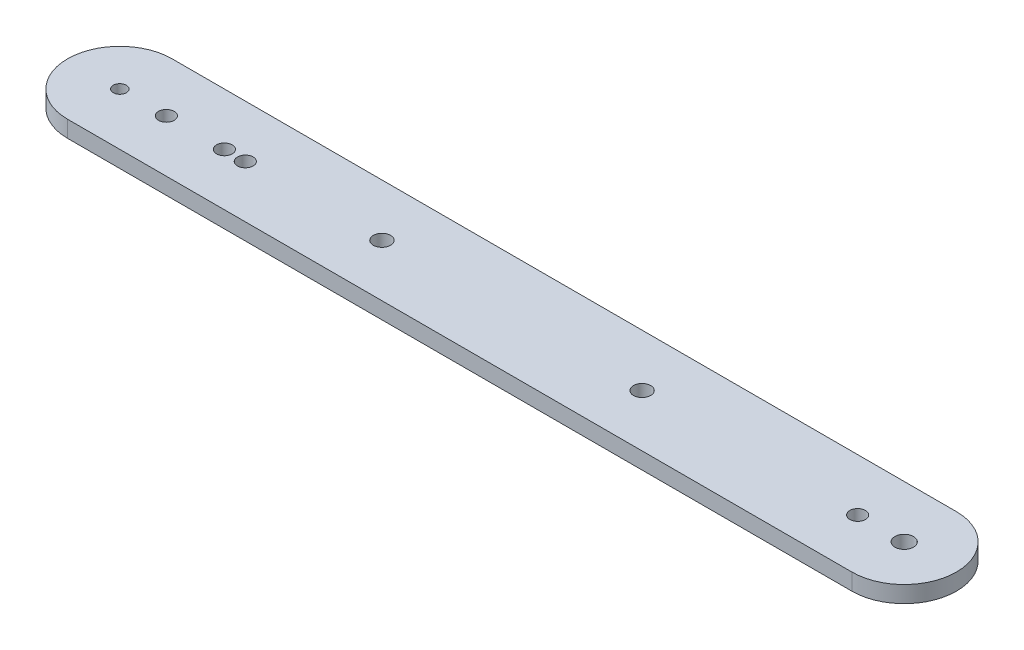
ISO-10303-21;
HEADER;
FILE_DESCRIPTION(('STEP AP214'),'2;1');
FILE_NAME('part.step','',(''),(''),'','','');
FILE_SCHEMA(('AUTOMOTIVE_DESIGN { 1 0 10303 214 1 1 1 1 }'));
ENDSEC;
DATA;
#1=APPLICATION_CONTEXT('core data for automotive mechanical design processes');
#2=APPLICATION_PROTOCOL_DEFINITION('international standard','automotive_design',2000,#1);
#3=PRODUCT_CONTEXT('',#1,'mechanical');
#4=PRODUCT('Part','Part','',(#3));
#5=PRODUCT_RELATED_PRODUCT_CATEGORY('part','',(#4));
#6=PRODUCT_DEFINITION_FORMATION('','',#4);
#7=PRODUCT_DEFINITION_CONTEXT('part definition',#1,'design');
#8=PRODUCT_DEFINITION('design','',#6,#7);
#9=PRODUCT_DEFINITION_SHAPE('','',#8);
#10=(LENGTH_UNIT() NAMED_UNIT(*) SI_UNIT(.MILLI.,.METRE.));
#11=(NAMED_UNIT(*) PLANE_ANGLE_UNIT() SI_UNIT($,.RADIAN.));
#12=(NAMED_UNIT(*) SI_UNIT($,.STERADIAN.) SOLID_ANGLE_UNIT());
#13=UNCERTAINTY_MEASURE_WITH_UNIT(LENGTH_MEASURE(1.E-05),#10,'distance_accuracy_value','');
#14=(GEOMETRIC_REPRESENTATION_CONTEXT(3) GLOBAL_UNCERTAINTY_ASSIGNED_CONTEXT((#13)) GLOBAL_UNIT_ASSIGNED_CONTEXT((#10,
#11,#12)) REPRESENTATION_CONTEXT('',''));
#15=CARTESIAN_POINT('',(0.,0.,0.));
#16=DIRECTION('',(0.,0.,1.));
#17=DIRECTION('',(1.,0.,0.));
#18=AXIS2_PLACEMENT_3D('',#15,#16,#17);
#19=CARTESIAN_POINT('',(75.,3.175,2.49999999999999));
#20=DIRECTION('',(0.,1.,0.));
#21=DIRECTION('',(0.,0.,1.));
#22=AXIS2_PLACEMENT_3D('',#19,#20,#21);
#23=PLANE('',#22);
#24=CARTESIAN_POINT('',(-24.8746859276655,3.175,2.50000000000001));
#25=DIRECTION('',(0.,1.,0.));
#26=DIRECTION('',(0.,0.,-1.));
#27=AXIS2_PLACEMENT_3D('',#24,#25,#26);
#28=CIRCLE('',#27,1.65);
#29=CARTESIAN_POINT('',(-24.8746859276655,3.175,0.850000000000008));
#30=VERTEX_POINT('',#29);
#31=EDGE_CURVE('E154',#30,#30,#28,.T.);
#32=ORIENTED_EDGE('',*,*,#31,.F.);
#33=EDGE_LOOP('',(#32));
#34=FACE_BOUND('',#33,.T.);
#35=CARTESIAN_POINT('',(75.,3.175,2.5));
#36=DIRECTION('',(0.,1.,0.));
#37=DIRECTION('',(0.,0.,1.));
#38=AXIS2_PLACEMENT_3D('',#35,#36,#37);
#39=CIRCLE('',#38,1.77581394138208);
#40=CARTESIAN_POINT('',(75.,3.175,4.27581394138209));
#41=VERTEX_POINT('',#40);
#42=EDGE_CURVE('E142',#41,#41,#39,.T.);
#43=ORIENTED_EDGE('',*,*,#42,.F.);
#44=EDGE_LOOP('',(#43));
#45=FACE_BOUND('',#44,.T.);
#46=CARTESIAN_POINT('',(-51.,3.175,2.50000000000008));
#47=DIRECTION('',(0.,1.,0.));
#48=DIRECTION('',(0.,0.,1.));
#49=AXIS2_PLACEMENT_3D('',#46,#47,#48);
#50=CIRCLE('',#49,1.5);
#51=CARTESIAN_POINT('',(-51.,3.175,4.00000000000008));
#52=VERTEX_POINT('',#51);
#53=EDGE_CURVE('E130',#52,#52,#50,.T.);
#54=ORIENTED_EDGE('',*,*,#53,.F.);
#55=EDGE_LOOP('',(#54));
#56=FACE_BOUND('',#55,.T.);
#57=CARTESIAN_POINT('',(-66.1,3.175,2.50000000000008));
#58=DIRECTION('',(0.,1.,0.));
#59=DIRECTION('',(0.,0.,1.));
#60=AXIS2_PLACEMENT_3D('',#57,#58,#59);
#61=CIRCLE('',#60,1.5);
#62=CARTESIAN_POINT('',(-66.1,3.175,4.00000000000007));
#63=VERTEX_POINT('',#62);
#64=EDGE_CURVE('E109',#63,#63,#61,.T.);
#65=ORIENTED_EDGE('',*,*,#64,.F.);
#66=EDGE_LOOP('',(#65));
#67=FACE_BOUND('',#66,.T.);
#68=CARTESIAN_POINT('',(75.,3.175,2.49999999999999));
#69=DIRECTION('',(0.,1.,0.));
#70=DIRECTION('',(0.,0.,1.));
#71=AXIS2_PLACEMENT_3D('',#68,#69,#70);
#72=CIRCLE('',#71,9.99999999999999);
#73=CARTESIAN_POINT('',(75.,3.175,12.5));
#74=VERTEX_POINT('',#73);
#75=CARTESIAN_POINT('',(75.,3.175,-7.5));
#76=VERTEX_POINT('',#75);
#77=EDGE_CURVE('E94',#74,#76,#72,.T.);
#78=ORIENTED_EDGE('',*,*,#77,.T.);
#79=DIRECTION('',(-1.,0.,0.));
#80=VECTOR('',#79,1.);
#81=CARTESIAN_POINT('',(-75.,3.175,-7.5));
#82=LINE('',#81,#80);
#83=CARTESIAN_POINT('',(-75.,3.175,-7.5));
#84=VERTEX_POINT('',#83);
#85=EDGE_CURVE('E89',#76,#84,#82,.T.);
#86=ORIENTED_EDGE('',*,*,#85,.T.);
#87=CARTESIAN_POINT('',(-75.,3.175,2.5));
#88=DIRECTION('',(0.,1.,0.));
#89=DIRECTION('',(0.,0.,1.));
#90=AXIS2_PLACEMENT_3D('',#87,#88,#89);
#91=CIRCLE('',#90,10.);
#92=CARTESIAN_POINT('',(-75.,3.175,12.5));
#93=VERTEX_POINT('',#92);
#94=EDGE_CURVE('E92',#84,#93,#91,.T.);
#95=ORIENTED_EDGE('',*,*,#94,.T.);
#96=DIRECTION('',(1.,0.,0.));
#97=VECTOR('',#96,1.);
#98=CARTESIAN_POINT('',(-75.,3.175,12.5));
#99=LINE('',#98,#97);
#100=EDGE_CURVE('E59',#93,#74,#99,.T.);
#101=ORIENTED_EDGE('',*,*,#100,.T.);
#102=EDGE_LOOP('',(#78,#86,#95,#101));
#103=FACE_BOUND('',#102,.T.);
#104=CARTESIAN_POINT('',(-55.,3.175,2.50000000000008));
#105=DIRECTION('',(0.,1.,0.));
#106=DIRECTION('',(0.,0.,1.));
#107=AXIS2_PLACEMENT_3D('',#104,#105,#106);
#108=CIRCLE('',#107,1.5);
#109=CARTESIAN_POINT('',(-55.,3.175,4.00000000000008));
#110=VERTEX_POINT('',#109);
#111=EDGE_CURVE('E124',#110,#110,#108,.T.);
#112=ORIENTED_EDGE('',*,*,#111,.F.);
#113=EDGE_LOOP('',(#112));
#114=FACE_BOUND('',#113,.T.);
#115=CARTESIAN_POINT('',(66.1,3.175,2.50000000000001));
#116=DIRECTION('',(0.,1.,0.));
#117=DIRECTION('',(0.,0.,1.));
#118=AXIS2_PLACEMENT_3D('',#115,#116,#117);
#119=CIRCLE('',#118,1.5);
#120=CARTESIAN_POINT('',(66.1,3.175,4.));
#121=VERTEX_POINT('',#120);
#122=EDGE_CURVE('E136',#121,#121,#119,.T.);
#123=ORIENTED_EDGE('',*,*,#122,.F.);
#124=EDGE_LOOP('',(#123));
#125=FACE_BOUND('',#124,.T.);
#126=CARTESIAN_POINT('',(24.8746859276655,3.175,2.5));
#127=DIRECTION('',(0.,1.,0.));
#128=DIRECTION('',(0.,0.,1.));
#129=AXIS2_PLACEMENT_3D('',#126,#127,#128);
#130=CIRCLE('',#129,1.65);
#131=CARTESIAN_POINT('',(24.8746859276655,3.175,4.15000000000001));
#132=VERTEX_POINT('',#131);
#133=EDGE_CURVE('E148',#132,#132,#130,.T.);
#134=ORIENTED_EDGE('',*,*,#133,.F.);
#135=EDGE_LOOP('',(#134));
#136=FACE_BOUND('',#135,.T.);
#137=CARTESIAN_POINT('',(-75.,3.175,2.5));
#138=DIRECTION('',(0.,1.,0.));
#139=DIRECTION('',(0.,0.,1.));
#140=AXIS2_PLACEMENT_3D('',#137,#138,#139);
#141=CIRCLE('',#140,1.25);
#142=CARTESIAN_POINT('',(-75.,3.175,3.75));
#143=VERTEX_POINT('',#142);
#144=EDGE_CURVE('E160',#143,#143,#141,.T.);
#145=ORIENTED_EDGE('',*,*,#144,.F.);
#146=EDGE_LOOP('',(#145));
#147=FACE_BOUND('',#146,.T.);
#148=ADVANCED_FACE('F42',(#34,#45,#56,#67,#103,#114,#125,#136,#147),#23,.T.);
#149=CARTESIAN_POINT('',(75.,0.,2.49999999999999));
#150=DIRECTION('',(0.,1.,0.));
#151=DIRECTION('',(0.,0.,1.));
#152=AXIS2_PLACEMENT_3D('',#149,#150,#151);
#153=PLANE('',#152);
#154=CARTESIAN_POINT('',(75.,0.,2.49999999999999));
#155=DIRECTION('',(0.,1.,0.));
#156=DIRECTION('',(0.,0.,1.));
#157=AXIS2_PLACEMENT_3D('',#154,#155,#156);
#158=CIRCLE('',#157,9.99999999999999);
#159=CARTESIAN_POINT('',(75.,0.,12.5));
#160=VERTEX_POINT('',#159);
#161=CARTESIAN_POINT('',(75.,0.,-7.5));
#162=VERTEX_POINT('',#161);
#163=EDGE_CURVE('E106',#160,#162,#158,.T.);
#164=ORIENTED_EDGE('',*,*,#163,.F.);
#165=DIRECTION('',(1.,0.,0.));
#166=VECTOR('',#165,1.);
#167=CARTESIAN_POINT('',(-75.,0.,12.5));
#168=LINE('',#167,#166);
#169=CARTESIAN_POINT('',(-75.,0.,12.5));
#170=VERTEX_POINT('',#169);
#171=EDGE_CURVE('E82',#170,#160,#168,.T.);
#172=ORIENTED_EDGE('',*,*,#171,.F.);
#173=CARTESIAN_POINT('',(-75.,0.,2.5));
#174=DIRECTION('',(0.,1.,0.));
#175=DIRECTION('',(0.,0.,1.));
#176=AXIS2_PLACEMENT_3D('',#173,#174,#175);
#177=CIRCLE('',#176,10.);
#178=CARTESIAN_POINT('',(-75.,0.,-7.5));
#179=VERTEX_POINT('',#178);
#180=EDGE_CURVE('E76',#179,#170,#177,.T.);
#181=ORIENTED_EDGE('',*,*,#180,.F.);
#182=DIRECTION('',(-1.,0.,0.));
#183=VECTOR('',#182,1.);
#184=CARTESIAN_POINT('',(-75.,0.,-7.5));
#185=LINE('',#184,#183);
#186=EDGE_CURVE('E98',#162,#179,#185,.T.);
#187=ORIENTED_EDGE('',*,*,#186,.F.);
#188=EDGE_LOOP('',(#164,#172,#181,#187));
#189=FACE_BOUND('',#188,.T.);
#190=CARTESIAN_POINT('',(-66.1,0.,2.50000000000008));
#191=DIRECTION('',(0.,1.,0.));
#192=DIRECTION('',(0.,0.,1.));
#193=AXIS2_PLACEMENT_3D('',#190,#191,#192);
#194=CIRCLE('',#193,1.5);
#195=CARTESIAN_POINT('',(-66.1,0.,4.00000000000007));
#196=VERTEX_POINT('',#195);
#197=EDGE_CURVE('E121',#196,#196,#194,.T.);
#198=ORIENTED_EDGE('',*,*,#197,.T.);
#199=EDGE_LOOP('',(#198));
#200=FACE_BOUND('',#199,.T.);
#201=CARTESIAN_POINT('',(-55.,0.,2.50000000000008));
#202=DIRECTION('',(0.,1.,0.));
#203=DIRECTION('',(0.,0.,1.));
#204=AXIS2_PLACEMENT_3D('',#201,#202,#203);
#205=CIRCLE('',#204,1.5);
#206=CARTESIAN_POINT('',(-55.,0.,4.00000000000008));
#207=VERTEX_POINT('',#206);
#208=EDGE_CURVE('E127',#207,#207,#205,.T.);
#209=ORIENTED_EDGE('',*,*,#208,.T.);
#210=EDGE_LOOP('',(#209));
#211=FACE_BOUND('',#210,.T.);
#212=CARTESIAN_POINT('',(-51.,0.,2.50000000000008));
#213=DIRECTION('',(0.,1.,0.));
#214=DIRECTION('',(0.,0.,1.));
#215=AXIS2_PLACEMENT_3D('',#212,#213,#214);
#216=CIRCLE('',#215,1.5);
#217=CARTESIAN_POINT('',(-51.,0.,4.00000000000008));
#218=VERTEX_POINT('',#217);
#219=EDGE_CURVE('E133',#218,#218,#216,.T.);
#220=ORIENTED_EDGE('',*,*,#219,.T.);
#221=EDGE_LOOP('',(#220));
#222=FACE_BOUND('',#221,.T.);
#223=CARTESIAN_POINT('',(66.1,0.,2.50000000000001));
#224=DIRECTION('',(0.,1.,0.));
#225=DIRECTION('',(0.,0.,1.));
#226=AXIS2_PLACEMENT_3D('',#223,#224,#225);
#227=CIRCLE('',#226,1.5);
#228=CARTESIAN_POINT('',(66.1,0.,4.));
#229=VERTEX_POINT('',#228);
#230=EDGE_CURVE('E139',#229,#229,#227,.T.);
#231=ORIENTED_EDGE('',*,*,#230,.T.);
#232=EDGE_LOOP('',(#231));
#233=FACE_BOUND('',#232,.T.);
#234=CARTESIAN_POINT('',(75.,0.,2.5));
#235=DIRECTION('',(0.,1.,0.));
#236=DIRECTION('',(0.,0.,1.));
#237=AXIS2_PLACEMENT_3D('',#234,#235,#236);
#238=CIRCLE('',#237,1.77581394138208);
#239=CARTESIAN_POINT('',(75.,0.,4.27581394138209));
#240=VERTEX_POINT('',#239);
#241=EDGE_CURVE('E145',#240,#240,#238,.T.);
#242=ORIENTED_EDGE('',*,*,#241,.T.);
#243=EDGE_LOOP('',(#242));
#244=FACE_BOUND('',#243,.T.);
#245=CARTESIAN_POINT('',(24.8746859276655,0.,2.5));
#246=DIRECTION('',(0.,1.,0.));
#247=DIRECTION('',(0.,0.,1.));
#248=AXIS2_PLACEMENT_3D('',#245,#246,#247);
#249=CIRCLE('',#248,1.65);
#250=CARTESIAN_POINT('',(24.8746859276655,0.,4.15000000000001));
#251=VERTEX_POINT('',#250);
#252=EDGE_CURVE('E151',#251,#251,#249,.T.);
#253=ORIENTED_EDGE('',*,*,#252,.T.);
#254=EDGE_LOOP('',(#253));
#255=FACE_BOUND('',#254,.T.);
#256=CARTESIAN_POINT('',(-24.8746859276655,0.,2.50000000000001));
#257=DIRECTION('',(0.,1.,0.));
#258=DIRECTION('',(0.,0.,-1.));
#259=AXIS2_PLACEMENT_3D('',#256,#257,#258);
#260=CIRCLE('',#259,1.65);
#261=CARTESIAN_POINT('',(-24.8746859276655,0.,0.850000000000008));
#262=VERTEX_POINT('',#261);
#263=EDGE_CURVE('E157',#262,#262,#260,.T.);
#264=ORIENTED_EDGE('',*,*,#263,.T.);
#265=EDGE_LOOP('',(#264));
#266=FACE_BOUND('',#265,.T.);
#267=CARTESIAN_POINT('',(-75.,0.,2.5));
#268=DIRECTION('',(0.,1.,0.));
#269=DIRECTION('',(0.,0.,1.));
#270=AXIS2_PLACEMENT_3D('',#267,#268,#269);
#271=CIRCLE('',#270,1.25);
#272=CARTESIAN_POINT('',(-75.,0.,3.75));
#273=VERTEX_POINT('',#272);
#274=EDGE_CURVE('E163',#273,#273,#271,.T.);
#275=ORIENTED_EDGE('',*,*,#274,.T.);
#276=EDGE_LOOP('',(#275));
#277=FACE_BOUND('',#276,.T.);
#278=ADVANCED_FACE('F117',(#189,#200,#211,#222,#233,#244,#255,#266,#277),#153,.F.);
#279=CARTESIAN_POINT('',(75.,3.175,2.49999999999999));
#280=DIRECTION('',(0.,-1.,0.));
#281=DIRECTION('',(0.,0.,-1.));
#282=AXIS2_PLACEMENT_3D('',#279,#280,#281);
#283=CYLINDRICAL_SURFACE('',#282,9.99999999999999);
#284=ORIENTED_EDGE('',*,*,#163,.T.);
#285=DIRECTION('',(0.,-1.,0.));
#286=VECTOR('',#285,1.);
#287=CARTESIAN_POINT('',(75.,3.175,-7.5));
#288=LINE('',#287,#286);
#289=EDGE_CURVE('E13',#76,#162,#288,.T.);
#290=ORIENTED_EDGE('',*,*,#289,.F.);
#291=ORIENTED_EDGE('',*,*,#77,.F.);
#292=DIRECTION('',(0.,-1.,0.));
#293=VECTOR('',#292,1.);
#294=CARTESIAN_POINT('',(75.,3.175,12.5));
#295=LINE('',#294,#293);
#296=EDGE_CURVE('E102',#74,#160,#295,.T.);
#297=ORIENTED_EDGE('',*,*,#296,.T.);
#298=EDGE_LOOP('',(#284,#290,#291,#297));
#299=FACE_BOUND('',#298,.T.);
#300=ADVANCED_FACE('F44',(#299),#283,.T.);
#301=CARTESIAN_POINT('',(-75.,3.175,-7.5));
#302=DIRECTION('',(0.,0.,1.));
#303=DIRECTION('',(1.,0.,0.));
#304=AXIS2_PLACEMENT_3D('',#301,#302,#303);
#305=PLANE('',#304);
#306=ORIENTED_EDGE('',*,*,#186,.T.);
#307=DIRECTION('',(0.,-1.,0.));
#308=VECTOR('',#307,1.);
#309=CARTESIAN_POINT('',(-75.,3.175,-7.5));
#310=LINE('',#309,#308);
#311=EDGE_CURVE('E51',#84,#179,#310,.T.);
#312=ORIENTED_EDGE('',*,*,#311,.F.);
#313=ORIENTED_EDGE('',*,*,#85,.F.);
#314=ORIENTED_EDGE('',*,*,#289,.T.);
#315=EDGE_LOOP('',(#306,#312,#313,#314));
#316=FACE_BOUND('',#315,.T.);
#317=ADVANCED_FACE('F97',(#316),#305,.F.);
#318=CARTESIAN_POINT('',(-75.,3.175,2.5));
#319=DIRECTION('',(0.,-1.,0.));
#320=DIRECTION('',(0.,0.,-1.));
#321=AXIS2_PLACEMENT_3D('',#318,#319,#320);
#322=CYLINDRICAL_SURFACE('',#321,10.);
#323=ORIENTED_EDGE('',*,*,#180,.T.);
#324=DIRECTION('',(0.,-1.,0.));
#325=VECTOR('',#324,1.);
#326=CARTESIAN_POINT('',(-75.,3.175,12.5));
#327=LINE('',#326,#325);
#328=EDGE_CURVE('E99',#93,#170,#327,.T.);
#329=ORIENTED_EDGE('',*,*,#328,.F.);
#330=ORIENTED_EDGE('',*,*,#94,.F.);
#331=ORIENTED_EDGE('',*,*,#311,.T.);
#332=EDGE_LOOP('',(#323,#329,#330,#331));
#333=FACE_BOUND('',#332,.T.);
#334=ADVANCED_FACE('F100',(#333),#322,.T.);
#335=CARTESIAN_POINT('',(-75.,3.175,12.5));
#336=DIRECTION('',(0.,0.,-1.));
#337=DIRECTION('',(-1.,0.,0.));
#338=AXIS2_PLACEMENT_3D('',#335,#336,#337);
#339=PLANE('',#338);
#340=ORIENTED_EDGE('',*,*,#171,.T.);
#341=ORIENTED_EDGE('',*,*,#296,.F.);
#342=ORIENTED_EDGE('',*,*,#100,.F.);
#343=ORIENTED_EDGE('',*,*,#328,.T.);
#344=EDGE_LOOP('',(#340,#341,#342,#343));
#345=FACE_BOUND('',#344,.T.);
#346=ADVANCED_FACE('F114',(#345),#339,.F.);
#347=CARTESIAN_POINT('',(-66.1,3.175,2.50000000000008));
#348=DIRECTION('',(0.,-1.,0.));
#349=DIRECTION('',(0.,0.,-1.));
#350=AXIS2_PLACEMENT_3D('',#347,#348,#349);
#351=CYLINDRICAL_SURFACE('',#350,1.5);
#352=ORIENTED_EDGE('',*,*,#64,.T.);
#353=EDGE_LOOP('',(#352));
#354=FACE_BOUND('',#353,.T.);
#355=ORIENTED_EDGE('',*,*,#197,.F.);
#356=EDGE_LOOP('',(#355));
#357=FACE_BOUND('',#356,.T.);
#358=ADVANCED_FACE('F182',(#354,#357),#351,.F.);
#359=CARTESIAN_POINT('',(-55.,3.175,2.50000000000008));
#360=DIRECTION('',(0.,-1.,0.));
#361=DIRECTION('',(0.,0.,-1.));
#362=AXIS2_PLACEMENT_3D('',#359,#360,#361);
#363=CYLINDRICAL_SURFACE('',#362,1.5);
#364=ORIENTED_EDGE('',*,*,#111,.T.);
#365=EDGE_LOOP('',(#364));
#366=FACE_BOUND('',#365,.T.);
#367=ORIENTED_EDGE('',*,*,#208,.F.);
#368=EDGE_LOOP('',(#367));
#369=FACE_BOUND('',#368,.T.);
#370=ADVANCED_FACE('F228',(#366,#369),#363,.F.);
#371=CARTESIAN_POINT('',(-51.,3.175,2.50000000000008));
#372=DIRECTION('',(0.,-1.,0.));
#373=DIRECTION('',(0.,0.,-1.));
#374=AXIS2_PLACEMENT_3D('',#371,#372,#373);
#375=CYLINDRICAL_SURFACE('',#374,1.5);
#376=ORIENTED_EDGE('',*,*,#53,.T.);
#377=EDGE_LOOP('',(#376));
#378=FACE_BOUND('',#377,.T.);
#379=ORIENTED_EDGE('',*,*,#219,.F.);
#380=EDGE_LOOP('',(#379));
#381=FACE_BOUND('',#380,.T.);
#382=ADVANCED_FACE('F236',(#378,#381),#375,.F.);
#383=CARTESIAN_POINT('',(66.1,3.175,2.50000000000001));
#384=DIRECTION('',(0.,-1.,0.));
#385=DIRECTION('',(0.,0.,-1.));
#386=AXIS2_PLACEMENT_3D('',#383,#384,#385);
#387=CYLINDRICAL_SURFACE('',#386,1.5);
#388=ORIENTED_EDGE('',*,*,#122,.T.);
#389=EDGE_LOOP('',(#388));
#390=FACE_BOUND('',#389,.T.);
#391=ORIENTED_EDGE('',*,*,#230,.F.);
#392=EDGE_LOOP('',(#391));
#393=FACE_BOUND('',#392,.T.);
#394=ADVANCED_FACE('F244',(#390,#393),#387,.F.);
#395=CARTESIAN_POINT('',(75.,3.175,2.5));
#396=DIRECTION('',(0.,-1.,0.));
#397=DIRECTION('',(0.,0.,-1.));
#398=AXIS2_PLACEMENT_3D('',#395,#396,#397);
#399=CYLINDRICAL_SURFACE('',#398,1.77581394138208);
#400=ORIENTED_EDGE('',*,*,#42,.T.);
#401=EDGE_LOOP('',(#400));
#402=FACE_BOUND('',#401,.T.);
#403=ORIENTED_EDGE('',*,*,#241,.F.);
#404=EDGE_LOOP('',(#403));
#405=FACE_BOUND('',#404,.T.);
#406=ADVANCED_FACE('F253',(#402,#405),#399,.F.);
#407=CARTESIAN_POINT('',(24.8746859276655,3.175,2.5));
#408=DIRECTION('',(0.,-1.,0.));
#409=DIRECTION('',(0.,0.,-1.));
#410=AXIS2_PLACEMENT_3D('',#407,#408,#409);
#411=CYLINDRICAL_SURFACE('',#410,1.65);
#412=ORIENTED_EDGE('',*,*,#133,.T.);
#413=EDGE_LOOP('',(#412));
#414=FACE_BOUND('',#413,.T.);
#415=ORIENTED_EDGE('',*,*,#252,.F.);
#416=EDGE_LOOP('',(#415));
#417=FACE_BOUND('',#416,.T.);
#418=ADVANCED_FACE('F262',(#414,#417),#411,.F.);
#419=CARTESIAN_POINT('',(-24.8746859276655,3.175,2.50000000000001));
#420=DIRECTION('',(0.,-1.,0.));
#421=DIRECTION('',(0.,0.,-1.));
#422=AXIS2_PLACEMENT_3D('',#419,#420,#421);
#423=CYLINDRICAL_SURFACE('',#422,1.65);
#424=ORIENTED_EDGE('',*,*,#31,.T.);
#425=EDGE_LOOP('',(#424));
#426=FACE_BOUND('',#425,.T.);
#427=ORIENTED_EDGE('',*,*,#263,.F.);
#428=EDGE_LOOP('',(#427));
#429=FACE_BOUND('',#428,.T.);
#430=ADVANCED_FACE('F271',(#426,#429),#423,.F.);
#431=CARTESIAN_POINT('',(-75.,3.175,2.5));
#432=DIRECTION('',(0.,-1.,0.));
#433=DIRECTION('',(0.,0.,-1.));
#434=AXIS2_PLACEMENT_3D('',#431,#432,#433);
#435=CYLINDRICAL_SURFACE('',#434,1.25);
#436=ORIENTED_EDGE('',*,*,#144,.T.);
#437=EDGE_LOOP('',(#436));
#438=FACE_BOUND('',#437,.T.);
#439=ORIENTED_EDGE('',*,*,#274,.F.);
#440=EDGE_LOOP('',(#439));
#441=FACE_BOUND('',#440,.T.);
#442=ADVANCED_FACE('F169',(#438,#441),#435,.F.);
#443=CLOSED_SHELL('',(#148,#278,#300,#317,#334,#346,#358,#370,#382,#394,#406,#418,#430,#442));
#444=MANIFOLD_SOLID_BREP('B2',#443);
#445=ADVANCED_BREP_SHAPE_REPRESENTATION('',(#18,#444),#14);
#446=SHAPE_DEFINITION_REPRESENTATION(#9,#445);
ENDSEC;
END-ISO-10303-21;
